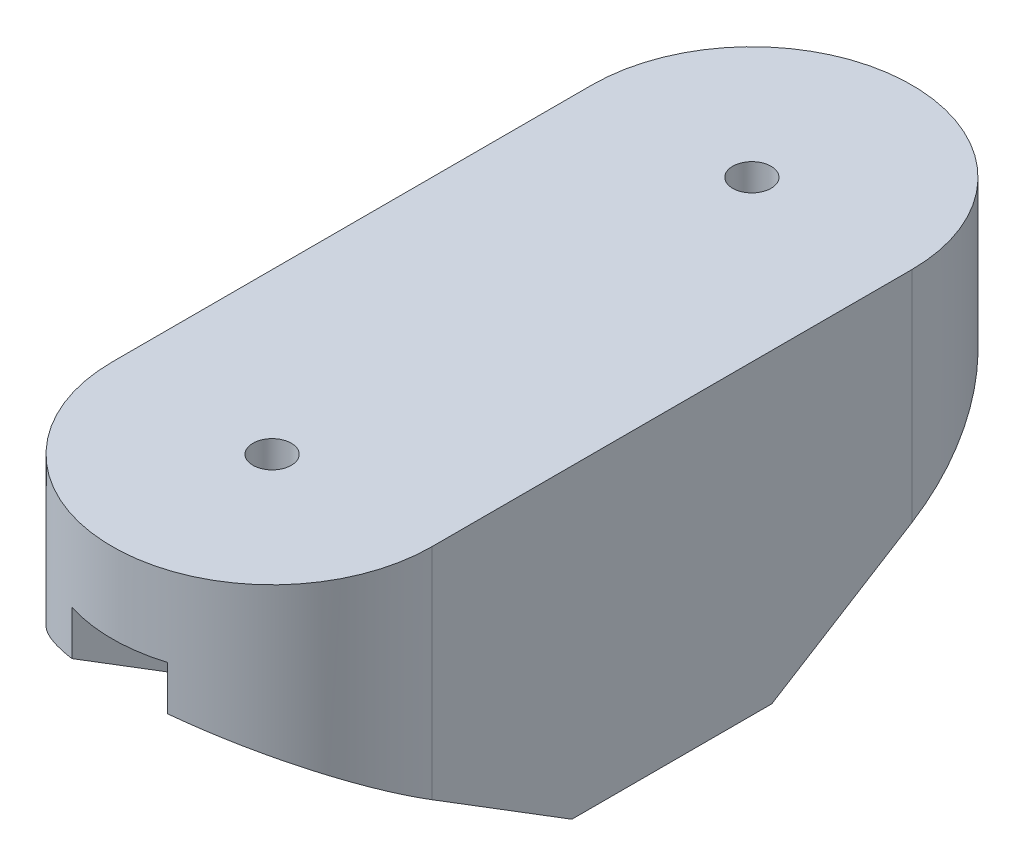
ISO-10303-21;
HEADER;
FILE_DESCRIPTION(('STEP AP214'),'2;1');
FILE_NAME('part.step','',(''),(''),'','','');
FILE_SCHEMA(('AUTOMOTIVE_DESIGN { 1 0 10303 214 1 1 1 1 }'));
ENDSEC;
DATA;
#1=APPLICATION_CONTEXT('core data for automotive mechanical design processes');
#2=APPLICATION_PROTOCOL_DEFINITION('international standard','automotive_design',2000,#1);
#3=PRODUCT_CONTEXT('',#1,'mechanical');
#4=PRODUCT('Part','Part','',(#3));
#5=PRODUCT_RELATED_PRODUCT_CATEGORY('part','',(#4));
#6=PRODUCT_DEFINITION_FORMATION('','',#4);
#7=PRODUCT_DEFINITION_CONTEXT('part definition',#1,'design');
#8=PRODUCT_DEFINITION('design','',#6,#7);
#9=PRODUCT_DEFINITION_SHAPE('','',#8);
#10=(LENGTH_UNIT() NAMED_UNIT(*) SI_UNIT(.MILLI.,.METRE.));
#11=(NAMED_UNIT(*) PLANE_ANGLE_UNIT() SI_UNIT($,.RADIAN.));
#12=(NAMED_UNIT(*) SI_UNIT($,.STERADIAN.) SOLID_ANGLE_UNIT());
#13=UNCERTAINTY_MEASURE_WITH_UNIT(LENGTH_MEASURE(1.E-05),#10,'distance_accuracy_value','');
#14=(GEOMETRIC_REPRESENTATION_CONTEXT(3) GLOBAL_UNCERTAINTY_ASSIGNED_CONTEXT((#13)) GLOBAL_UNIT_ASSIGNED_CONTEXT((#10,
#11,#12)) REPRESENTATION_CONTEXT('',''));
#15=CARTESIAN_POINT('',(0.,0.,0.));
#16=DIRECTION('',(0.,0.,1.));
#17=DIRECTION('',(1.,0.,0.));
#18=AXIS2_PLACEMENT_3D('',#15,#16,#17);
#19=CARTESIAN_POINT('',(12.7,-9.525,50.8));
#20=DIRECTION('',(0.,0.849570871554159,-0.527474486782731));
#21=DIRECTION('',(0.,0.527474486782732,0.84957087155416));
#22=AXIS2_PLACEMENT_3D('',#19,#20,#21);
#23=PLANE('',#22);
#24=CARTESIAN_POINT('',(0.,-17.4100702236131,38.1));
#25=DIRECTION('',(0.,0.849570871554159,-0.527474486782731));
#26=DIRECTION('',(0.,0.527474486782732,0.84957087155416));
#27=AXIS2_PLACEMENT_3D('',#24,#25,#26);
#28=ELLIPSE('',#27,14.9487234381839,12.7);
#29=CARTESIAN_POINT('',(3.81,-9.88819263138309,50.2150278579952));
#30=VERTEX_POINT('',#29);
#31=CARTESIAN_POINT('',(12.7,-17.4100702236131,38.1));
#32=VERTEX_POINT('',#31);
#33=EDGE_CURVE('E324',#30,#32,#28,.T.);
#34=ORIENTED_EDGE('',*,*,#33,.F.);
#35=DIRECTION('',(0.,-0.527474486782732,-0.84957087155416));
#36=VECTOR('',#35,1.);
#37=CARTESIAN_POINT('',(3.81,-9.525,50.8));
#38=LINE('',#37,#36);
#39=CARTESIAN_POINT('',(3.81,-24.3055695851321,26.9938412204572));
#40=VERTEX_POINT('',#39);
#41=EDGE_CURVE('E361',#30,#40,#38,.T.);
#42=ORIENTED_EDGE('',*,*,#41,.T.);
#43=DIRECTION('',(-1.,0.,0.));
#44=VECTOR('',#43,1.);
#45=CARTESIAN_POINT('',(12.7,-24.3055695851321,26.9938412204572));
#46=LINE('',#45,#44);
#47=CARTESIAN_POINT('',(12.7,-24.3055695851321,26.9938412204572));
#48=VERTEX_POINT('',#47);
#49=EDGE_CURVE('E383',#48,#40,#46,.T.);
#50=ORIENTED_EDGE('',*,*,#49,.F.);
#51=DIRECTION('',(0.,-0.527474486782732,-0.84957087155416));
#52=VECTOR('',#51,1.);
#53=CARTESIAN_POINT('',(12.7,-9.525,50.8));
#54=LINE('',#53,#52);
#55=EDGE_CURVE('E371',#32,#48,#54,.T.);
#56=ORIENTED_EDGE('',*,*,#55,.F.);
#57=EDGE_LOOP('',(#34,#42,#50,#56));
#58=FACE_BOUND('',#57,.T.);
#59=ADVANCED_FACE('F69',(#58),#23,.F.);
#60=CARTESIAN_POINT('',(3.81,-35.5513930955508,-12.700025));
#61=DIRECTION('',(1.,0.,0.));
#62=DIRECTION('',(0.,0.,-1.));
#63=AXIS2_PLACEMENT_3D('',#60,#61,#62);
#64=PLANE('',#63);
#65=DIRECTION('',(0.,1.,0.));
#66=VECTOR('',#65,1.);
#67=CARTESIAN_POINT('',(3.81,-24.3055695851321,50.2150278579952));
#68=LINE('',#67,#66);
#69=CARTESIAN_POINT('',(3.81,-6.35,50.2150278579952));
#70=VERTEX_POINT('',#69);
#71=EDGE_CURVE('E12',#70,#30,#68,.F.);
#72=ORIENTED_EDGE('',*,*,#71,.F.);
#73=DIRECTION('',(0.,0.,1.));
#74=VECTOR('',#73,1.);
#75=CARTESIAN_POINT('',(3.81,-6.35,-12.700025));
#76=LINE('',#75,#74);
#77=CARTESIAN_POINT('',(3.81,-6.35,-12.1150278579952));
#78=VERTEX_POINT('',#77);
#79=EDGE_CURVE('E346',#78,#70,#76,.T.);
#80=ORIENTED_EDGE('',*,*,#79,.F.);
#81=DIRECTION('',(0.,1.,0.));
#82=VECTOR('',#81,1.);
#83=CARTESIAN_POINT('',(3.81,-24.3055695851321,-12.1150278579952));
#84=LINE('',#83,#82);
#85=CARTESIAN_POINT('',(3.81,-9.88799924795836,-12.1150278579952));
#86=VERTEX_POINT('',#85);
#87=EDGE_CURVE('E77',#78,#86,#84,.F.);
#88=ORIENTED_EDGE('',*,*,#87,.T.);
#89=DIRECTION('',(0.,0.527271728125035,-0.849696725143765));
#90=VECTOR('',#89,1.);
#91=CARTESIAN_POINT('',(3.81,-9.525,-12.7));
#92=LINE('',#91,#90);
#93=CARTESIAN_POINT('',(3.81,-24.3055695851321,11.1188412204572));
#94=VERTEX_POINT('',#93);
#95=EDGE_CURVE('E411',#94,#86,#92,.T.);
#96=ORIENTED_EDGE('',*,*,#95,.F.);
#97=DIRECTION('',(0.,0.,-1.));
#98=VECTOR('',#97,1.);
#99=CARTESIAN_POINT('',(3.81,-24.3055695851321,11.1188412204572));
#100=LINE('',#99,#98);
#101=EDGE_CURVE('E358',#40,#94,#100,.T.);
#102=ORIENTED_EDGE('',*,*,#101,.F.);
#103=ORIENTED_EDGE('',*,*,#41,.F.);
#104=EDGE_LOOP('',(#72,#80,#88,#96,#102,#103));
#105=FACE_BOUND('',#104,.T.);
#106=ADVANCED_FACE('F419',(#105),#64,.F.);
#107=CARTESIAN_POINT('',(-3.78470994955958,-35.5513930955508,-12.700025));
#108=DIRECTION('',(-1.,0.,0.));
#109=DIRECTION('',(0.,0.,1.));
#110=AXIS2_PLACEMENT_3D('',#107,#108,#109);
#111=PLANE('',#110);
#112=DIRECTION('',(0.,1.,0.));
#113=VECTOR('',#112,1.);
#114=CARTESIAN_POINT('',(-3.78470994955958,-24.3055695851321,50.2229522228583));
#115=LINE('',#114,#113);
#116=CARTESIAN_POINT('',(-3.78470994955958,-9.88327261772775,50.2229522228583));
#117=VERTEX_POINT('',#116);
#118=CARTESIAN_POINT('',(-3.78470994955958,-6.35,50.2229522228583));
#119=VERTEX_POINT('',#118);
#120=EDGE_CURVE('E338',#117,#119,#115,.T.);
#121=ORIENTED_EDGE('',*,*,#120,.F.);
#122=DIRECTION('',(0.,0.527474486782732,0.84957087155416));
#123=VECTOR('',#122,1.);
#124=CARTESIAN_POINT('',(-3.78470994955958,-9.525,50.8));
#125=LINE('',#124,#123);
#126=CARTESIAN_POINT('',(-3.78470994955958,-24.3055695851321,26.9938412204572));
#127=VERTEX_POINT('',#126);
#128=EDGE_CURVE('E355',#127,#117,#125,.T.);
#129=ORIENTED_EDGE('',*,*,#128,.F.);
#130=DIRECTION('',(0.,0.,1.));
#131=VECTOR('',#130,1.);
#132=CARTESIAN_POINT('',(-3.78470994955958,-24.3055695851321,11.1188412204572));
#133=LINE('',#132,#131);
#134=CARTESIAN_POINT('',(-3.78470994955958,-24.3055695851321,11.1188412204572));
#135=VERTEX_POINT('',#134);
#136=EDGE_CURVE('E350',#135,#127,#133,.T.);
#137=ORIENTED_EDGE('',*,*,#136,.F.);
#138=DIRECTION('',(0.,-0.527271728125035,0.849696725143765));
#139=VECTOR('',#138,1.);
#140=CARTESIAN_POINT('',(-3.78470994955958,-9.525,-12.7));
#141=LINE('',#140,#139);
#142=CARTESIAN_POINT('',(-3.78470994955958,-9.88308185398471,-12.1229522228583));
#143=VERTEX_POINT('',#142);
#144=EDGE_CURVE('E406',#143,#135,#141,.T.);
#145=ORIENTED_EDGE('',*,*,#144,.F.);
#146=DIRECTION('',(0.,1.,0.));
#147=VECTOR('',#146,1.);
#148=CARTESIAN_POINT('',(-3.78470994955958,-24.3055695851321,-12.1229522228583));
#149=LINE('',#148,#147);
#150=CARTESIAN_POINT('',(-3.78470994955958,-6.35,-12.1229522228583));
#151=VERTEX_POINT('',#150);
#152=EDGE_CURVE('E414',#151,#143,#149,.F.);
#153=ORIENTED_EDGE('',*,*,#152,.F.);
#154=DIRECTION('',(0.,0.,1.));
#155=VECTOR('',#154,1.);
#156=CARTESIAN_POINT('',(-3.78470994955958,-6.35,-12.700025));
#157=LINE('',#156,#155);
#158=EDGE_CURVE('E347',#151,#119,#157,.T.);
#159=ORIENTED_EDGE('',*,*,#158,.T.);
#160=EDGE_LOOP('',(#121,#129,#137,#145,#153,#159));
#161=FACE_BOUND('',#160,.T.);
#162=ADVANCED_FACE('F479',(#161),#111,.F.);
#163=CARTESIAN_POINT('',(-12.7,-6.35,0.));
#164=DIRECTION('',(-1.,0.,0.));
#165=DIRECTION('',(0.,0.,1.));
#166=AXIS2_PLACEMENT_3D('',#163,#164,#165);
#167=PLANE('',#166);
#168=DIRECTION('',(0.,-0.527474486782732,-0.84957087155416));
#169=VECTOR('',#168,1.);
#170=CARTESIAN_POINT('',(-12.7,-9.525,50.8));
#171=LINE('',#170,#169);
#172=CARTESIAN_POINT('',(-12.7,-17.4100702236131,38.1));
#173=VERTEX_POINT('',#172);
#174=CARTESIAN_POINT('',(-12.7,-24.3055695851321,26.9938412204572));
#175=VERTEX_POINT('',#174);
#176=EDGE_CURVE('E363',#173,#175,#171,.T.);
#177=ORIENTED_EDGE('',*,*,#176,.F.);
#178=DIRECTION('',(0.,1.,0.));
#179=VECTOR('',#178,1.);
#180=CARTESIAN_POINT('',(-12.7,-6.35,38.1));
#181=LINE('',#180,#179);
#182=CARTESIAN_POINT('',(-12.7,0.,38.1));
#183=VERTEX_POINT('',#182);
#184=EDGE_CURVE('E401',#173,#183,#181,.T.);
#185=ORIENTED_EDGE('',*,*,#184,.T.);
#186=DIRECTION('',(0.,0.,1.));
#187=VECTOR('',#186,1.);
#188=CARTESIAN_POINT('',(-12.7,0.,0.));
#189=LINE('',#188,#187);
#190=CARTESIAN_POINT('',(-12.7,0.,0.));
#191=VERTEX_POINT('',#190);
#192=EDGE_CURVE('E454',#191,#183,#189,.T.);
#193=ORIENTED_EDGE('',*,*,#192,.F.);
#194=DIRECTION('',(0.,1.,0.));
#195=VECTOR('',#194,1.);
#196=CARTESIAN_POINT('',(-12.7,-6.35,0.));
#197=LINE('',#196,#195);
#198=CARTESIAN_POINT('',(-12.7,-17.4058717852301,0.));
#199=VERTEX_POINT('',#198);
#200=EDGE_CURVE('E399',#199,#191,#197,.T.);
#201=ORIENTED_EDGE('',*,*,#200,.F.);
#202=DIRECTION('',(0.,0.527271728125035,-0.849696725143765));
#203=VECTOR('',#202,1.);
#204=CARTESIAN_POINT('',(-12.7,-9.525,-12.7));
#205=LINE('',#204,#203);
#206=CARTESIAN_POINT('',(-12.7,-24.3055695851321,11.1188412204572));
#207=VERTEX_POINT('',#206);
#208=EDGE_CURVE('E368',#207,#199,#205,.T.);
#209=ORIENTED_EDGE('',*,*,#208,.F.);
#210=DIRECTION('',(0.,0.,-1.));
#211=VECTOR('',#210,1.);
#212=CARTESIAN_POINT('',(-12.7,-24.3055695851321,11.1188412204572));
#213=LINE('',#212,#211);
#214=EDGE_CURVE('E365',#175,#207,#213,.T.);
#215=ORIENTED_EDGE('',*,*,#214,.F.);
#216=EDGE_LOOP('',(#177,#185,#193,#201,#209,#215));
#217=FACE_BOUND('',#216,.T.);
#218=ADVANCED_FACE('F452',(#217),#167,.T.);
#219=CARTESIAN_POINT('',(0.,-17.4100702236131,38.1));
#220=DIRECTION('',(0.,0.849570871554159,-0.527474486782731));
#221=DIRECTION('',(0.,0.527474486782732,0.84957087155416));
#222=AXIS2_PLACEMENT_3D('',#219,#220,#221);
#223=ELLIPSE('',#222,14.9487234381839,12.7);
#224=EDGE_CURVE('E336',#173,#117,#223,.T.);
#225=ORIENTED_EDGE('',*,*,#224,.F.);
#226=ORIENTED_EDGE('',*,*,#176,.T.);
#227=EDGE_CURVE('E382',#127,#175,#46,.T.);
#228=ORIENTED_EDGE('',*,*,#227,.F.);
#229=ORIENTED_EDGE('',*,*,#128,.T.);
#230=EDGE_LOOP('',(#225,#226,#228,#229));
#231=FACE_BOUND('',#230,.T.);
#232=ADVANCED_FACE('F477',(#231),#23,.F.);
#233=CARTESIAN_POINT('',(12.7,-9.525,-12.7));
#234=DIRECTION('',(0.,0.849696725143765,0.527271728125035));
#235=DIRECTION('',(0.,-0.527271728125035,0.849696725143765));
#236=AXIS2_PLACEMENT_3D('',#233,#234,#235);
#237=PLANE('',#236);
#238=ORIENTED_EDGE('',*,*,#95,.T.);
#239=CARTESIAN_POINT('',(0.,-17.4058717852301,0.));
#240=DIRECTION('',(0.,0.849696725143765,0.527271728125035));
#241=DIRECTION('',(0.,0.527271728125035,-0.849696725143765));
#242=AXIS2_PLACEMENT_3D('',#239,#240,#241);
#243=ELLIPSE('',#242,14.9465092946559,12.7);
#244=CARTESIAN_POINT('',(12.7,-17.4058717852301,0.));
#245=VERTEX_POINT('',#244);
#246=EDGE_CURVE('E340',#86,#245,#243,.F.);
#247=ORIENTED_EDGE('',*,*,#246,.T.);
#248=DIRECTION('',(0.,0.527271728125035,-0.849696725143765));
#249=VECTOR('',#248,1.);
#250=CARTESIAN_POINT('',(12.7,-9.525,-12.7));
#251=LINE('',#250,#249);
#252=CARTESIAN_POINT('',(12.7,-24.3055695851321,11.1188412204572));
#253=VERTEX_POINT('',#252);
#254=EDGE_CURVE('E375',#253,#245,#251,.T.);
#255=ORIENTED_EDGE('',*,*,#254,.F.);
#256=DIRECTION('',(-1.,0.,0.));
#257=VECTOR('',#256,1.);
#258=CARTESIAN_POINT('',(12.7,-24.3055695851321,11.1188412204572));
#259=LINE('',#258,#257);
#260=EDGE_CURVE('E379',#253,#94,#259,.T.);
#261=ORIENTED_EDGE('',*,*,#260,.T.);
#262=EDGE_LOOP('',(#238,#247,#255,#261));
#263=FACE_BOUND('',#262,.T.);
#264=ADVANCED_FACE('F424',(#263),#237,.F.);
#265=CARTESIAN_POINT('',(0.,-17.4058717852301,0.));
#266=DIRECTION('',(0.,0.849696725143765,0.527271728125035));
#267=DIRECTION('',(0.,0.527271728125035,-0.849696725143765));
#268=AXIS2_PLACEMENT_3D('',#265,#266,#267);
#269=ELLIPSE('',#268,14.9465092946559,12.7);
#270=EDGE_CURVE('E343',#143,#199,#269,.T.);
#271=ORIENTED_EDGE('',*,*,#270,.F.);
#272=ORIENTED_EDGE('',*,*,#144,.T.);
#273=EDGE_CURVE('E378',#135,#207,#259,.T.);
#274=ORIENTED_EDGE('',*,*,#273,.T.);
#275=ORIENTED_EDGE('',*,*,#208,.T.);
#276=EDGE_LOOP('',(#271,#272,#274,#275));
#277=FACE_BOUND('',#276,.T.);
#278=ADVANCED_FACE('F468',(#277),#237,.F.);
#279=CARTESIAN_POINT('',(12.7,-24.3055695851321,11.1188412204572));
#280=DIRECTION('',(0.,1.,0.));
#281=DIRECTION('',(0.,0.,1.));
#282=AXIS2_PLACEMENT_3D('',#279,#280,#281);
#283=PLANE('',#282);
#284=ORIENTED_EDGE('',*,*,#49,.T.);
#285=ORIENTED_EDGE('',*,*,#101,.T.);
#286=ORIENTED_EDGE('',*,*,#260,.F.);
#287=DIRECTION('',(0.,0.,-1.));
#288=VECTOR('',#287,1.);
#289=CARTESIAN_POINT('',(12.7,-24.3055695851321,11.1188412204572));
#290=LINE('',#289,#288);
#291=EDGE_CURVE('E373',#48,#253,#290,.T.);
#292=ORIENTED_EDGE('',*,*,#291,.F.);
#293=EDGE_LOOP('',(#284,#285,#286,#292));
#294=FACE_BOUND('',#293,.T.);
#295=ADVANCED_FACE('F429',(#294),#283,.F.);
#296=CARTESIAN_POINT('',(0.,-6.35,0.));
#297=DIRECTION('',(0.,1.,0.));
#298=DIRECTION('',(0.,0.,1.));
#299=AXIS2_PLACEMENT_3D('',#296,#297,#298);
#300=CYLINDRICAL_SURFACE('',#299,12.7);
#301=CARTESIAN_POINT('',(0.,0.,0.));
#302=DIRECTION('',(0.,1.,0.));
#303=DIRECTION('',(0.,0.,1.));
#304=AXIS2_PLACEMENT_3D('',#301,#302,#303);
#305=CIRCLE('',#304,12.7);
#306=CARTESIAN_POINT('',(12.7,0.,0.));
#307=VERTEX_POINT('',#306);
#308=EDGE_CURVE('E386',#307,#191,#305,.T.);
#309=ORIENTED_EDGE('',*,*,#308,.F.);
#310=DIRECTION('',(0.,1.,0.));
#311=VECTOR('',#310,1.);
#312=CARTESIAN_POINT('',(12.7,-6.35,0.));
#313=LINE('',#312,#311);
#314=EDGE_CURVE('E404',#245,#307,#313,.T.);
#315=ORIENTED_EDGE('',*,*,#314,.F.);
#316=ORIENTED_EDGE('',*,*,#246,.F.);
#317=ORIENTED_EDGE('',*,*,#87,.F.);
#318=CARTESIAN_POINT('',(0.,-6.35,0.));
#319=DIRECTION('',(0.,1.,0.));
#320=DIRECTION('',(0.,0.,1.));
#321=AXIS2_PLACEMENT_3D('',#318,#319,#320);
#322=CIRCLE('',#321,12.7);
#323=EDGE_CURVE('E392',#78,#151,#322,.T.);
#324=ORIENTED_EDGE('',*,*,#323,.T.);
#325=ORIENTED_EDGE('',*,*,#152,.T.);
#326=ORIENTED_EDGE('',*,*,#270,.T.);
#327=ORIENTED_EDGE('',*,*,#200,.T.);
#328=EDGE_LOOP('',(#309,#315,#316,#317,#324,#325,#326,#327));
#329=FACE_BOUND('',#328,.T.);
#330=ADVANCED_FACE('F71',(#329),#300,.T.);
#331=CARTESIAN_POINT('',(12.7,-6.35,0.));
#332=DIRECTION('',(1.,0.,0.));
#333=DIRECTION('',(0.,0.,-1.));
#334=AXIS2_PLACEMENT_3D('',#331,#332,#333);
#335=PLANE('',#334);
#336=DIRECTION('',(0.,1.,0.));
#337=VECTOR('',#336,1.);
#338=CARTESIAN_POINT('',(12.7,-6.35,38.1));
#339=LINE('',#338,#337);
#340=CARTESIAN_POINT('',(12.7,0.,38.1));
#341=VERTEX_POINT('',#340);
#342=EDGE_CURVE('E407',#32,#341,#339,.T.);
#343=ORIENTED_EDGE('',*,*,#342,.F.);
#344=ORIENTED_EDGE('',*,*,#55,.T.);
#345=ORIENTED_EDGE('',*,*,#291,.T.);
#346=ORIENTED_EDGE('',*,*,#254,.T.);
#347=ORIENTED_EDGE('',*,*,#314,.T.);
#348=DIRECTION('',(0.,0.,-1.));
#349=VECTOR('',#348,1.);
#350=CARTESIAN_POINT('',(12.7,0.,0.));
#351=LINE('',#350,#349);
#352=EDGE_CURVE('E396',#341,#307,#351,.T.);
#353=ORIENTED_EDGE('',*,*,#352,.F.);
#354=EDGE_LOOP('',(#343,#344,#345,#346,#347,#353));
#355=FACE_BOUND('',#354,.T.);
#356=ADVANCED_FACE('F514',(#355),#335,.T.);
#357=CARTESIAN_POINT('',(0.,-6.35,38.1));
#358=DIRECTION('',(0.,1.,0.));
#359=DIRECTION('',(0.,0.,1.));
#360=AXIS2_PLACEMENT_3D('',#357,#358,#359);
#361=CYLINDRICAL_SURFACE('',#360,12.7);
#362=CARTESIAN_POINT('',(0.,0.,38.1));
#363=DIRECTION('',(0.,1.,0.));
#364=DIRECTION('',(0.,0.,1.));
#365=AXIS2_PLACEMENT_3D('',#362,#363,#364);
#366=CIRCLE('',#365,12.7);
#367=EDGE_CURVE('E458',#183,#341,#366,.T.);
#368=ORIENTED_EDGE('',*,*,#367,.F.);
#369=ORIENTED_EDGE('',*,*,#184,.F.);
#370=ORIENTED_EDGE('',*,*,#224,.T.);
#371=ORIENTED_EDGE('',*,*,#120,.T.);
#372=CARTESIAN_POINT('',(0.,-6.35,38.1));
#373=DIRECTION('',(0.,1.,0.));
#374=DIRECTION('',(0.,0.,1.));
#375=AXIS2_PLACEMENT_3D('',#372,#373,#374);
#376=CIRCLE('',#375,12.7);
#377=EDGE_CURVE('E395',#119,#70,#376,.T.);
#378=ORIENTED_EDGE('',*,*,#377,.T.);
#379=ORIENTED_EDGE('',*,*,#71,.T.);
#380=ORIENTED_EDGE('',*,*,#33,.T.);
#381=ORIENTED_EDGE('',*,*,#342,.T.);
#382=EDGE_LOOP('',(#368,#369,#370,#371,#378,#379,#380,#381));
#383=FACE_BOUND('',#382,.T.);
#384=ADVANCED_FACE('F437',(#383),#361,.T.);
#385=CARTESIAN_POINT('',(0.,0.,0.));
#386=DIRECTION('',(0.,1.,0.));
#387=DIRECTION('',(0.,0.,1.));
#388=AXIS2_PLACEMENT_3D('',#385,#386,#387);
#389=PLANE('',#388);
#390=CARTESIAN_POINT('',(0.,0.,0.));
#391=DIRECTION('',(0.,-1.,0.));
#392=DIRECTION('',(0.,0.,-1.));
#393=AXIS2_PLACEMENT_3D('',#390,#391,#392);
#394=CIRCLE('',#393,1.524);
#395=CARTESIAN_POINT('',(0.,0.,-1.524));
#396=VERTEX_POINT('',#395);
#397=EDGE_CURVE('E524',#396,#396,#394,.T.);
#398=ORIENTED_EDGE('',*,*,#397,.T.);
#399=EDGE_LOOP('',(#398));
#400=FACE_BOUND('',#399,.T.);
#401=CARTESIAN_POINT('',(0.,0.,38.1));
#402=DIRECTION('',(0.,-1.,0.));
#403=DIRECTION('',(0.,0.,-1.));
#404=AXIS2_PLACEMENT_3D('',#401,#402,#403);
#405=CIRCLE('',#404,1.524);
#406=CARTESIAN_POINT('',(0.,0.,36.576));
#407=VERTEX_POINT('',#406);
#408=EDGE_CURVE('E268',#407,#407,#405,.T.);
#409=ORIENTED_EDGE('',*,*,#408,.T.);
#410=EDGE_LOOP('',(#409));
#411=FACE_BOUND('',#410,.T.);
#412=ORIENTED_EDGE('',*,*,#308,.T.);
#413=ORIENTED_EDGE('',*,*,#192,.T.);
#414=ORIENTED_EDGE('',*,*,#367,.T.);
#415=ORIENTED_EDGE('',*,*,#352,.T.);
#416=EDGE_LOOP('',(#412,#413,#414,#415));
#417=FACE_BOUND('',#416,.T.);
#418=ADVANCED_FACE('F462',(#400,#411,#417),#389,.T.);
#419=ORIENTED_EDGE('',*,*,#273,.F.);
#420=ORIENTED_EDGE('',*,*,#136,.T.);
#421=ORIENTED_EDGE('',*,*,#227,.T.);
#422=ORIENTED_EDGE('',*,*,#214,.T.);
#423=EDGE_LOOP('',(#419,#420,#421,#422));
#424=FACE_BOUND('',#423,.T.);
#425=ADVANCED_FACE('F474',(#424),#283,.F.);
#426=CARTESIAN_POINT('',(-3.78470994955958,-6.35,-12.700025));
#427=DIRECTION('',(0.,1.,0.));
#428=DIRECTION('',(0.,0.,1.));
#429=AXIS2_PLACEMENT_3D('',#426,#427,#428);
#430=PLANE('',#429);
#431=DIRECTION('',(-0.866025403784438,0.,-0.500000000000001));
#432=VECTOR('',#431,1.);
#433=CARTESIAN_POINT('',(0.,-6.35,40.4931881594501));
#434=LINE('',#433,#432);
#435=CARTESIAN_POINT('',(0.,-6.35,40.4931881594501));
#436=VERTEX_POINT('',#435);
#437=CARTESIAN_POINT('',(-2.1693028239279,-6.35,39.2407405901014));
#438=VERTEX_POINT('',#437);
#439=EDGE_CURVE('E267',#436,#438,#434,.T.);
#440=ORIENTED_EDGE('',*,*,#439,.F.);
#441=DIRECTION('',(-0.866025403784438,0.,0.5));
#442=VECTOR('',#441,1.);
#443=CARTESIAN_POINT('',(2.16930282392797,-6.35,39.2407405901015));
#444=LINE('',#443,#442);
#445=CARTESIAN_POINT('',(2.16930282392797,-6.35,39.2407405901015));
#446=VERTEX_POINT('',#445);
#447=EDGE_CURVE('E84',#446,#436,#444,.T.);
#448=ORIENTED_EDGE('',*,*,#447,.F.);
#449=DIRECTION('',(0.,0.,1.));
#450=VECTOR('',#449,1.);
#451=CARTESIAN_POINT('',(2.16930282392797,-6.35,36.7358454514042));
#452=LINE('',#451,#450);
#453=CARTESIAN_POINT('',(2.16930282392797,-6.35,36.7358454514042));
#454=VERTEX_POINT('',#453);
#455=EDGE_CURVE('E250',#454,#446,#452,.T.);
#456=ORIENTED_EDGE('',*,*,#455,.F.);
#457=DIRECTION('',(0.866025403784439,0.,0.499999999999999));
#458=VECTOR('',#457,1.);
#459=CARTESIAN_POINT('',(0.,-6.35,35.4833978820556));
#460=LINE('',#459,#458);
#461=CARTESIAN_POINT('',(0.,-6.35,35.4833978820556));
#462=VERTEX_POINT('',#461);
#463=EDGE_CURVE('E253',#462,#454,#460,.T.);
#464=ORIENTED_EDGE('',*,*,#463,.F.);
#465=DIRECTION('',(0.866025403784439,0.,-0.5));
#466=VECTOR('',#465,1.);
#467=CARTESIAN_POINT('',(-2.1693028239279,-6.35,36.7358454514042));
#468=LINE('',#467,#466);
#469=CARTESIAN_POINT('',(-2.1693028239279,-6.35,36.7358454514042));
#470=VERTEX_POINT('',#469);
#471=EDGE_CURVE('E273',#470,#462,#468,.T.);
#472=ORIENTED_EDGE('',*,*,#471,.F.);
#473=DIRECTION('',(0.,0.,-1.));
#474=VECTOR('',#473,1.);
#475=CARTESIAN_POINT('',(-2.1693028239279,-6.35,39.2407405901014));
#476=LINE('',#475,#474);
#477=EDGE_CURVE('E270',#438,#470,#476,.T.);
#478=ORIENTED_EDGE('',*,*,#477,.F.);
#479=EDGE_LOOP('',(#440,#448,#456,#464,#472,#478));
#480=FACE_BOUND('',#479,.T.);
#481=DIRECTION('',(-0.866025403784439,0.,-0.5));
#482=VECTOR('',#481,1.);
#483=CARTESIAN_POINT('',(0.,-6.35,2.50489513869723));
#484=LINE('',#483,#482);
#485=CARTESIAN_POINT('',(0.,-6.35,2.50489513869723));
#486=VERTEX_POINT('',#485);
#487=CARTESIAN_POINT('',(-2.1693028239279,-6.35,1.25244756934862));
#488=VERTEX_POINT('',#487);
#489=EDGE_CURVE('E308',#486,#488,#484,.T.);
#490=ORIENTED_EDGE('',*,*,#489,.F.);
#491=DIRECTION('',(-0.866025403784439,0.,0.5));
#492=VECTOR('',#491,1.);
#493=CARTESIAN_POINT('',(2.16930282392797,-6.35,1.25244756934862));
#494=LINE('',#493,#492);
#495=CARTESIAN_POINT('',(2.16930282392797,-6.35,1.25244756934862));
#496=VERTEX_POINT('',#495);
#497=EDGE_CURVE('E92',#496,#486,#494,.T.);
#498=ORIENTED_EDGE('',*,*,#497,.F.);
#499=DIRECTION('',(0.,0.,1.));
#500=VECTOR('',#499,1.);
#501=CARTESIAN_POINT('',(2.16930282392797,-6.35,-1.25244756934859));
#502=LINE('',#501,#500);
#503=CARTESIAN_POINT('',(2.16930282392797,-6.35,-1.25244756934859));
#504=VERTEX_POINT('',#503);
#505=EDGE_CURVE('E291',#504,#496,#502,.T.);
#506=ORIENTED_EDGE('',*,*,#505,.F.);
#507=DIRECTION('',(0.866025403784439,0.,0.5));
#508=VECTOR('',#507,1.);
#509=CARTESIAN_POINT('',(0.,-6.35,-2.5048951386972));
#510=LINE('',#509,#508);
#511=CARTESIAN_POINT('',(0.,-6.35,-2.5048951386972));
#512=VERTEX_POINT('',#511);
#513=EDGE_CURVE('E317',#512,#504,#510,.T.);
#514=ORIENTED_EDGE('',*,*,#513,.F.);
#515=DIRECTION('',(0.866025403784439,0.,-0.5));
#516=VECTOR('',#515,1.);
#517=CARTESIAN_POINT('',(-2.1693028239279,-6.35,-1.2524475693486));
#518=LINE('',#517,#516);
#519=CARTESIAN_POINT('',(-2.1693028239279,-6.35,-1.2524475693486));
#520=VERTEX_POINT('',#519);
#521=EDGE_CURVE('E314',#520,#512,#518,.T.);
#522=ORIENTED_EDGE('',*,*,#521,.F.);
#523=DIRECTION('',(0.,0.,-1.));
#524=VECTOR('',#523,1.);
#525=CARTESIAN_POINT('',(-2.1693028239279,-6.35,1.25244756934862));
#526=LINE('',#525,#524);
#527=EDGE_CURVE('E311',#488,#520,#526,.T.);
#528=ORIENTED_EDGE('',*,*,#527,.F.);
#529=EDGE_LOOP('',(#490,#498,#506,#514,#522,#528));
#530=FACE_BOUND('',#529,.T.);
#531=ORIENTED_EDGE('',*,*,#323,.F.);
#532=ORIENTED_EDGE('',*,*,#79,.T.);
#533=ORIENTED_EDGE('',*,*,#377,.F.);
#534=ORIENTED_EDGE('',*,*,#158,.F.);
#535=EDGE_LOOP('',(#531,#532,#533,#534));
#536=FACE_BOUND('',#535,.T.);
#537=ADVANCED_FACE('F481',(#480,#530,#536),#430,.F.);
#538=CARTESIAN_POINT('',(2.16930282392797,-4.572,1.25244756934862));
#539=DIRECTION('',(0.5,0.,0.866025403784439));
#540=DIRECTION('',(0.866025403784439,0.,-0.5));
#541=AXIS2_PLACEMENT_3D('',#538,#539,#540);
#542=PLANE('',#541);
#543=ORIENTED_EDGE('',*,*,#497,.T.);
#544=DIRECTION('',(0.,-1.,0.));
#545=VECTOR('',#544,1.);
#546=CARTESIAN_POINT('',(0.,-4.572,2.50489513869723));
#547=LINE('',#546,#545);
#548=CARTESIAN_POINT('',(0.,-4.572,2.50489513869723));
#549=VERTEX_POINT('',#548);
#550=EDGE_CURVE('E306',#549,#486,#547,.T.);
#551=ORIENTED_EDGE('',*,*,#550,.F.);
#552=DIRECTION('',(-0.866025403784439,0.,0.5));
#553=VECTOR('',#552,1.);
#554=CARTESIAN_POINT('',(2.16930282392797,-4.572,1.25244756934862));
#555=LINE('',#554,#553);
#556=CARTESIAN_POINT('',(2.16930282392797,-4.572,1.25244756934862));
#557=VERTEX_POINT('',#556);
#558=EDGE_CURVE('E287',#557,#549,#555,.T.);
#559=ORIENTED_EDGE('',*,*,#558,.F.);
#560=DIRECTION('',(0.,-1.,0.));
#561=VECTOR('',#560,1.);
#562=CARTESIAN_POINT('',(2.16930282392797,-4.572,1.25244756934862));
#563=LINE('',#562,#561);
#564=EDGE_CURVE('E322',#557,#496,#563,.T.);
#565=ORIENTED_EDGE('',*,*,#564,.T.);
#566=EDGE_LOOP('',(#543,#551,#559,#565));
#567=FACE_BOUND('',#566,.T.);
#568=ADVANCED_FACE('F483',(#567),#542,.F.);
#569=CARTESIAN_POINT('',(2.16930282392797,-4.572,-1.25244756934859));
#570=DIRECTION('',(1.,0.,0.));
#571=DIRECTION('',(0.,0.,-1.));
#572=AXIS2_PLACEMENT_3D('',#569,#570,#571);
#573=PLANE('',#572);
#574=ORIENTED_EDGE('',*,*,#505,.T.);
#575=ORIENTED_EDGE('',*,*,#564,.F.);
#576=DIRECTION('',(0.,0.,1.));
#577=VECTOR('',#576,1.);
#578=CARTESIAN_POINT('',(2.16930282392797,-4.572,-1.25244756934859));
#579=LINE('',#578,#577);
#580=CARTESIAN_POINT('',(2.16930282392797,-4.572,-1.25244756934859));
#581=VERTEX_POINT('',#580);
#582=EDGE_CURVE('E303',#581,#557,#579,.T.);
#583=ORIENTED_EDGE('',*,*,#582,.F.);
#584=DIRECTION('',(0.,-1.,0.));
#585=VECTOR('',#584,1.);
#586=CARTESIAN_POINT('',(2.16930282392797,-4.572,-1.25244756934859));
#587=LINE('',#586,#585);
#588=EDGE_CURVE('E325',#581,#504,#587,.T.);
#589=ORIENTED_EDGE('',*,*,#588,.T.);
#590=EDGE_LOOP('',(#574,#575,#583,#589));
#591=FACE_BOUND('',#590,.T.);
#592=ADVANCED_FACE('F490',(#591),#573,.F.);
#593=CARTESIAN_POINT('',(0.,-4.572,-2.5048951386972));
#594=DIRECTION('',(0.5,0.,-0.866025403784439));
#595=DIRECTION('',(-0.866025403784439,0.,-0.5));
#596=AXIS2_PLACEMENT_3D('',#593,#594,#595);
#597=PLANE('',#596);
#598=ORIENTED_EDGE('',*,*,#513,.T.);
#599=ORIENTED_EDGE('',*,*,#588,.F.);
#600=DIRECTION('',(0.866025403784439,0.,0.5));
#601=VECTOR('',#600,1.);
#602=CARTESIAN_POINT('',(0.,-4.572,-2.5048951386972));
#603=LINE('',#602,#601);
#604=CARTESIAN_POINT('',(0.,-4.572,-2.5048951386972));
#605=VERTEX_POINT('',#604);
#606=EDGE_CURVE('E300',#605,#581,#603,.T.);
#607=ORIENTED_EDGE('',*,*,#606,.F.);
#608=DIRECTION('',(0.,-1.,0.));
#609=VECTOR('',#608,1.);
#610=CARTESIAN_POINT('',(0.,-4.572,-2.5048951386972));
#611=LINE('',#610,#609);
#612=EDGE_CURVE('E327',#605,#512,#611,.T.);
#613=ORIENTED_EDGE('',*,*,#612,.T.);
#614=EDGE_LOOP('',(#598,#599,#607,#613));
#615=FACE_BOUND('',#614,.T.);
#616=ADVANCED_FACE('F558',(#615),#597,.F.);
#617=CARTESIAN_POINT('',(-2.1693028239279,-4.572,-1.2524475693486));
#618=DIRECTION('',(-0.5,0.,-0.866025403784439));
#619=DIRECTION('',(-0.866025403784439,0.,0.5));
#620=AXIS2_PLACEMENT_3D('',#617,#618,#619);
#621=PLANE('',#620);
#622=ORIENTED_EDGE('',*,*,#521,.T.);
#623=ORIENTED_EDGE('',*,*,#612,.F.);
#624=DIRECTION('',(0.866025403784439,0.,-0.5));
#625=VECTOR('',#624,1.);
#626=CARTESIAN_POINT('',(-2.1693028239279,-4.572,-1.2524475693486));
#627=LINE('',#626,#625);
#628=CARTESIAN_POINT('',(-2.1693028239279,-4.572,-1.2524475693486));
#629=VERTEX_POINT('',#628);
#630=EDGE_CURVE('E297',#629,#605,#627,.T.);
#631=ORIENTED_EDGE('',*,*,#630,.F.);
#632=DIRECTION('',(0.,-1.,0.));
#633=VECTOR('',#632,1.);
#634=CARTESIAN_POINT('',(-2.1693028239279,-4.572,-1.2524475693486));
#635=LINE('',#634,#633);
#636=EDGE_CURVE('E329',#629,#520,#635,.T.);
#637=ORIENTED_EDGE('',*,*,#636,.T.);
#638=EDGE_LOOP('',(#622,#623,#631,#637));
#639=FACE_BOUND('',#638,.T.);
#640=ADVANCED_FACE('F554',(#639),#621,.F.);
#641=CARTESIAN_POINT('',(-2.1693028239279,-4.572,1.25244756934862));
#642=DIRECTION('',(-1.,0.,0.));
#643=DIRECTION('',(0.,0.,1.));
#644=AXIS2_PLACEMENT_3D('',#641,#642,#643);
#645=PLANE('',#644);
#646=ORIENTED_EDGE('',*,*,#527,.T.);
#647=ORIENTED_EDGE('',*,*,#636,.F.);
#648=DIRECTION('',(0.,0.,-1.));
#649=VECTOR('',#648,1.);
#650=CARTESIAN_POINT('',(-2.1693028239279,-4.572,1.25244756934862));
#651=LINE('',#650,#649);
#652=CARTESIAN_POINT('',(-2.1693028239279,-4.572,1.25244756934862));
#653=VERTEX_POINT('',#652);
#654=EDGE_CURVE('E294',#653,#629,#651,.T.);
#655=ORIENTED_EDGE('',*,*,#654,.F.);
#656=DIRECTION('',(0.,-1.,0.));
#657=VECTOR('',#656,1.);
#658=CARTESIAN_POINT('',(-2.1693028239279,-4.572,1.25244756934862));
#659=LINE('',#658,#657);
#660=EDGE_CURVE('E331',#653,#488,#659,.T.);
#661=ORIENTED_EDGE('',*,*,#660,.T.);
#662=EDGE_LOOP('',(#646,#647,#655,#661));
#663=FACE_BOUND('',#662,.T.);
#664=ADVANCED_FACE('F550',(#663),#645,.F.);
#665=CARTESIAN_POINT('',(0.,-4.572,2.50489513869723));
#666=DIRECTION('',(-0.5,0.,0.866025403784439));
#667=DIRECTION('',(0.866025403784439,0.,0.5));
#668=AXIS2_PLACEMENT_3D('',#665,#666,#667);
#669=PLANE('',#668);
#670=ORIENTED_EDGE('',*,*,#489,.T.);
#671=ORIENTED_EDGE('',*,*,#660,.F.);
#672=DIRECTION('',(-0.866025403784439,0.,-0.5));
#673=VECTOR('',#672,1.);
#674=CARTESIAN_POINT('',(0.,-4.572,2.50489513869723));
#675=LINE('',#674,#673);
#676=EDGE_CURVE('E290',#549,#653,#675,.T.);
#677=ORIENTED_EDGE('',*,*,#676,.F.);
#678=ORIENTED_EDGE('',*,*,#550,.T.);
#679=EDGE_LOOP('',(#670,#671,#677,#678));
#680=FACE_BOUND('',#679,.T.);
#681=ADVANCED_FACE('F540',(#680),#669,.F.);
#682=CARTESIAN_POINT('',(0.,-4.572,0.));
#683=DIRECTION('',(0.,-1.,0.));
#684=DIRECTION('',(0.,0.,-1.));
#685=AXIS2_PLACEMENT_3D('',#682,#683,#684);
#686=PLANE('',#685);
#687=CARTESIAN_POINT('',(0.,-4.572,0.));
#688=DIRECTION('',(0.,-1.,0.));
#689=DIRECTION('',(0.,0.,-1.));
#690=AXIS2_PLACEMENT_3D('',#687,#688,#689);
#691=CIRCLE('',#690,1.524);
#692=CARTESIAN_POINT('',(0.,-4.572,-1.524));
#693=VERTEX_POINT('',#692);
#694=EDGE_CURVE('E530',#693,#693,#691,.T.);
#695=ORIENTED_EDGE('',*,*,#694,.F.);
#696=EDGE_LOOP('',(#695));
#697=FACE_BOUND('',#696,.T.);
#698=ORIENTED_EDGE('',*,*,#558,.T.);
#699=ORIENTED_EDGE('',*,*,#676,.T.);
#700=ORIENTED_EDGE('',*,*,#654,.T.);
#701=ORIENTED_EDGE('',*,*,#630,.T.);
#702=ORIENTED_EDGE('',*,*,#606,.T.);
#703=ORIENTED_EDGE('',*,*,#582,.T.);
#704=EDGE_LOOP('',(#698,#699,#700,#701,#702,#703));
#705=FACE_BOUND('',#704,.T.);
#706=ADVANCED_FACE('F537',(#697,#705),#686,.T.);
#707=CARTESIAN_POINT('',(2.16930282392797,-4.572,39.2407405901015));
#708=DIRECTION('',(0.5,0.,0.866025403784439));
#709=DIRECTION('',(0.866025403784439,0.,-0.5));
#710=AXIS2_PLACEMENT_3D('',#707,#708,#709);
#711=PLANE('',#710);
#712=ORIENTED_EDGE('',*,*,#447,.T.);
#713=DIRECTION('',(0.,-1.,0.));
#714=VECTOR('',#713,1.);
#715=CARTESIAN_POINT('',(0.,-4.572,40.4931881594501));
#716=LINE('',#715,#714);
#717=CARTESIAN_POINT('',(0.,-4.572,40.4931881594501));
#718=VERTEX_POINT('',#717);
#719=EDGE_CURVE('E227',#718,#436,#716,.T.);
#720=ORIENTED_EDGE('',*,*,#719,.F.);
#721=DIRECTION('',(-0.866025403784438,0.,0.5));
#722=VECTOR('',#721,1.);
#723=CARTESIAN_POINT('',(2.16930282392797,-4.572,39.2407405901015));
#724=LINE('',#723,#722);
#725=CARTESIAN_POINT('',(2.16930282392797,-4.572,39.2407405901015));
#726=VERTEX_POINT('',#725);
#727=EDGE_CURVE('E231',#726,#718,#724,.T.);
#728=ORIENTED_EDGE('',*,*,#727,.F.);
#729=DIRECTION('',(0.,-1.,0.));
#730=VECTOR('',#729,1.);
#731=CARTESIAN_POINT('',(2.16930282392797,-4.572,39.2407405901015));
#732=LINE('',#731,#730);
#733=EDGE_CURVE('E278',#726,#446,#732,.T.);
#734=ORIENTED_EDGE('',*,*,#733,.T.);
#735=EDGE_LOOP('',(#712,#720,#728,#734));
#736=FACE_BOUND('',#735,.T.);
#737=ADVANCED_FACE('F229',(#736),#711,.F.);
#738=CARTESIAN_POINT('',(2.16930282392797,-4.572,36.7358454514042));
#739=DIRECTION('',(1.,0.,0.));
#740=DIRECTION('',(0.,0.,-1.));
#741=AXIS2_PLACEMENT_3D('',#738,#739,#740);
#742=PLANE('',#741);
#743=ORIENTED_EDGE('',*,*,#455,.T.);
#744=ORIENTED_EDGE('',*,*,#733,.F.);
#745=DIRECTION('',(0.,0.,1.));
#746=VECTOR('',#745,1.);
#747=CARTESIAN_POINT('',(2.16930282392797,-4.572,36.7358454514042));
#748=LINE('',#747,#746);
#749=CARTESIAN_POINT('',(2.16930282392797,-4.572,36.7358454514042));
#750=VERTEX_POINT('',#749);
#751=EDGE_CURVE('E237',#750,#726,#748,.T.);
#752=ORIENTED_EDGE('',*,*,#751,.F.);
#753=DIRECTION('',(0.,-1.,0.));
#754=VECTOR('',#753,1.);
#755=CARTESIAN_POINT('',(2.16930282392797,-4.572,36.7358454514042));
#756=LINE('',#755,#754);
#757=EDGE_CURVE('E280',#750,#454,#756,.T.);
#758=ORIENTED_EDGE('',*,*,#757,.T.);
#759=EDGE_LOOP('',(#743,#744,#752,#758));
#760=FACE_BOUND('',#759,.T.);
#761=ADVANCED_FACE('F589',(#760),#742,.F.);
#762=CARTESIAN_POINT('',(0.,-4.572,35.4833978820556));
#763=DIRECTION('',(0.499999999999999,0.,-0.866025403784439));
#764=DIRECTION('',(-0.866025403784439,0.,-0.499999999999999));
#765=AXIS2_PLACEMENT_3D('',#762,#763,#764);
#766=PLANE('',#765);
#767=ORIENTED_EDGE('',*,*,#463,.T.);
#768=ORIENTED_EDGE('',*,*,#757,.F.);
#769=DIRECTION('',(0.866025403784439,0.,0.499999999999999));
#770=VECTOR('',#769,1.);
#771=CARTESIAN_POINT('',(0.,-4.572,35.4833978820556));
#772=LINE('',#771,#770);
#773=CARTESIAN_POINT('',(0.,-4.572,35.4833978820556));
#774=VERTEX_POINT('',#773);
#775=EDGE_CURVE('E263',#774,#750,#772,.T.);
#776=ORIENTED_EDGE('',*,*,#775,.F.);
#777=DIRECTION('',(0.,-1.,0.));
#778=VECTOR('',#777,1.);
#779=CARTESIAN_POINT('',(0.,-4.572,35.4833978820556));
#780=LINE('',#779,#778);
#781=EDGE_CURVE('E282',#774,#462,#780,.T.);
#782=ORIENTED_EDGE('',*,*,#781,.T.);
#783=EDGE_LOOP('',(#767,#768,#776,#782));
#784=FACE_BOUND('',#783,.T.);
#785=ADVANCED_FACE('F595',(#784),#766,.F.);
#786=CARTESIAN_POINT('',(-2.1693028239279,-4.572,36.7358454514042));
#787=DIRECTION('',(-0.5,0.,-0.866025403784439));
#788=DIRECTION('',(-0.866025403784439,0.,0.5));
#789=AXIS2_PLACEMENT_3D('',#786,#787,#788);
#790=PLANE('',#789);
#791=ORIENTED_EDGE('',*,*,#471,.T.);
#792=ORIENTED_EDGE('',*,*,#781,.F.);
#793=DIRECTION('',(0.866025403784439,0.,-0.5));
#794=VECTOR('',#793,1.);
#795=CARTESIAN_POINT('',(-2.1693028239279,-4.572,36.7358454514042));
#796=LINE('',#795,#794);
#797=CARTESIAN_POINT('',(-2.1693028239279,-4.572,36.7358454514042));
#798=VERTEX_POINT('',#797);
#799=EDGE_CURVE('E260',#798,#774,#796,.T.);
#800=ORIENTED_EDGE('',*,*,#799,.F.);
#801=DIRECTION('',(0.,-1.,0.));
#802=VECTOR('',#801,1.);
#803=CARTESIAN_POINT('',(-2.1693028239279,-4.572,36.7358454514042));
#804=LINE('',#803,#802);
#805=EDGE_CURVE('E284',#798,#470,#804,.T.);
#806=ORIENTED_EDGE('',*,*,#805,.T.);
#807=EDGE_LOOP('',(#791,#792,#800,#806));
#808=FACE_BOUND('',#807,.T.);
#809=ADVANCED_FACE('F603',(#808),#790,.F.);
#810=CARTESIAN_POINT('',(-2.1693028239279,-4.572,39.2407405901014));
#811=DIRECTION('',(-1.,0.,0.));
#812=DIRECTION('',(0.,0.,1.));
#813=AXIS2_PLACEMENT_3D('',#810,#811,#812);
#814=PLANE('',#813);
#815=ORIENTED_EDGE('',*,*,#477,.T.);
#816=ORIENTED_EDGE('',*,*,#805,.F.);
#817=DIRECTION('',(0.,0.,-1.));
#818=VECTOR('',#817,1.);
#819=CARTESIAN_POINT('',(-2.1693028239279,-4.572,39.2407405901014));
#820=LINE('',#819,#818);
#821=CARTESIAN_POINT('',(-2.1693028239279,-4.572,39.2407405901014));
#822=VERTEX_POINT('',#821);
#823=EDGE_CURVE('E245',#822,#798,#820,.T.);
#824=ORIENTED_EDGE('',*,*,#823,.F.);
#825=DIRECTION('',(0.,-1.,0.));
#826=VECTOR('',#825,1.);
#827=CARTESIAN_POINT('',(-2.1693028239279,-4.572,39.2407405901014));
#828=LINE('',#827,#826);
#829=EDGE_CURVE('E236',#822,#438,#828,.T.);
#830=ORIENTED_EDGE('',*,*,#829,.T.);
#831=EDGE_LOOP('',(#815,#816,#824,#830));
#832=FACE_BOUND('',#831,.T.);
#833=ADVANCED_FACE('F611',(#832),#814,.F.);
#834=CARTESIAN_POINT('',(0.,-4.572,40.4931881594501));
#835=DIRECTION('',(-0.500000000000001,0.,0.866025403784438));
#836=DIRECTION('',(0.866025403784438,0.,0.500000000000001));
#837=AXIS2_PLACEMENT_3D('',#834,#835,#836);
#838=PLANE('',#837);
#839=ORIENTED_EDGE('',*,*,#439,.T.);
#840=ORIENTED_EDGE('',*,*,#829,.F.);
#841=DIRECTION('',(-0.866025403784438,0.,-0.500000000000001));
#842=VECTOR('',#841,1.);
#843=CARTESIAN_POINT('',(0.,-4.572,40.4931881594501));
#844=LINE('',#843,#842);
#845=EDGE_CURVE('E240',#718,#822,#844,.T.);
#846=ORIENTED_EDGE('',*,*,#845,.F.);
#847=ORIENTED_EDGE('',*,*,#719,.T.);
#848=EDGE_LOOP('',(#839,#840,#846,#847));
#849=FACE_BOUND('',#848,.T.);
#850=ADVANCED_FACE('F241',(#849),#838,.F.);
#851=CARTESIAN_POINT('',(0.,-4.572,0.));
#852=DIRECTION('',(0.,-1.,0.));
#853=DIRECTION('',(0.,0.,-1.));
#854=AXIS2_PLACEMENT_3D('',#851,#852,#853);
#855=PLANE('',#854);
#856=CARTESIAN_POINT('',(0.,-4.572,38.1));
#857=DIRECTION('',(0.,-1.,0.));
#858=DIRECTION('',(0.,0.,-1.));
#859=AXIS2_PLACEMENT_3D('',#856,#857,#858);
#860=CIRCLE('',#859,1.524);
#861=CARTESIAN_POINT('',(0.,-4.572,36.576));
#862=VERTEX_POINT('',#861);
#863=EDGE_CURVE('E256',#862,#862,#860,.T.);
#864=ORIENTED_EDGE('',*,*,#863,.F.);
#865=EDGE_LOOP('',(#864));
#866=FACE_BOUND('',#865,.T.);
#867=ORIENTED_EDGE('',*,*,#727,.T.);
#868=ORIENTED_EDGE('',*,*,#845,.T.);
#869=ORIENTED_EDGE('',*,*,#823,.T.);
#870=ORIENTED_EDGE('',*,*,#799,.T.);
#871=ORIENTED_EDGE('',*,*,#775,.T.);
#872=ORIENTED_EDGE('',*,*,#751,.T.);
#873=EDGE_LOOP('',(#867,#868,#869,#870,#871,#872));
#874=FACE_BOUND('',#873,.T.);
#875=ADVANCED_FACE('F247',(#866,#874),#855,.T.);
#876=CARTESIAN_POINT('',(0.,0.,38.1));
#877=DIRECTION('',(0.,-1.,0.));
#878=DIRECTION('',(0.,0.,-1.));
#879=AXIS2_PLACEMENT_3D('',#876,#877,#878);
#880=CYLINDRICAL_SURFACE('',#879,1.524);
#881=ORIENTED_EDGE('',*,*,#408,.F.);
#882=EDGE_LOOP('',(#881));
#883=FACE_BOUND('',#882,.T.);
#884=ORIENTED_EDGE('',*,*,#863,.T.);
#885=EDGE_LOOP('',(#884));
#886=FACE_BOUND('',#885,.T.);
#887=ADVANCED_FACE('F631',(#883,#886),#880,.F.);
#888=CARTESIAN_POINT('',(0.,0.,0.));
#889=DIRECTION('',(0.,-1.,0.));
#890=DIRECTION('',(0.,0.,-1.));
#891=AXIS2_PLACEMENT_3D('',#888,#889,#890);
#892=CYLINDRICAL_SURFACE('',#891,1.524);
#893=ORIENTED_EDGE('',*,*,#397,.F.);
#894=EDGE_LOOP('',(#893));
#895=FACE_BOUND('',#894,.T.);
#896=ORIENTED_EDGE('',*,*,#694,.T.);
#897=EDGE_LOOP('',(#896));
#898=FACE_BOUND('',#897,.T.);
#899=ADVANCED_FACE('F535',(#895,#898),#892,.F.);
#900=CLOSED_SHELL('',(#59,#106,#162,#218,#232,#264,#278,#295,#330,#356,#384,#418,#425,#537,#568,
#592,#616,#640,#664,#681,#706,#737,#761,#785,#809,#833,#850,#875,#887,#899));
#901=MANIFOLD_SOLID_BREP('B2',#900);
#902=ADVANCED_BREP_SHAPE_REPRESENTATION('',(#18,#901),#14);
#903=SHAPE_DEFINITION_REPRESENTATION(#9,#902);
ENDSEC;
END-ISO-10303-21;
